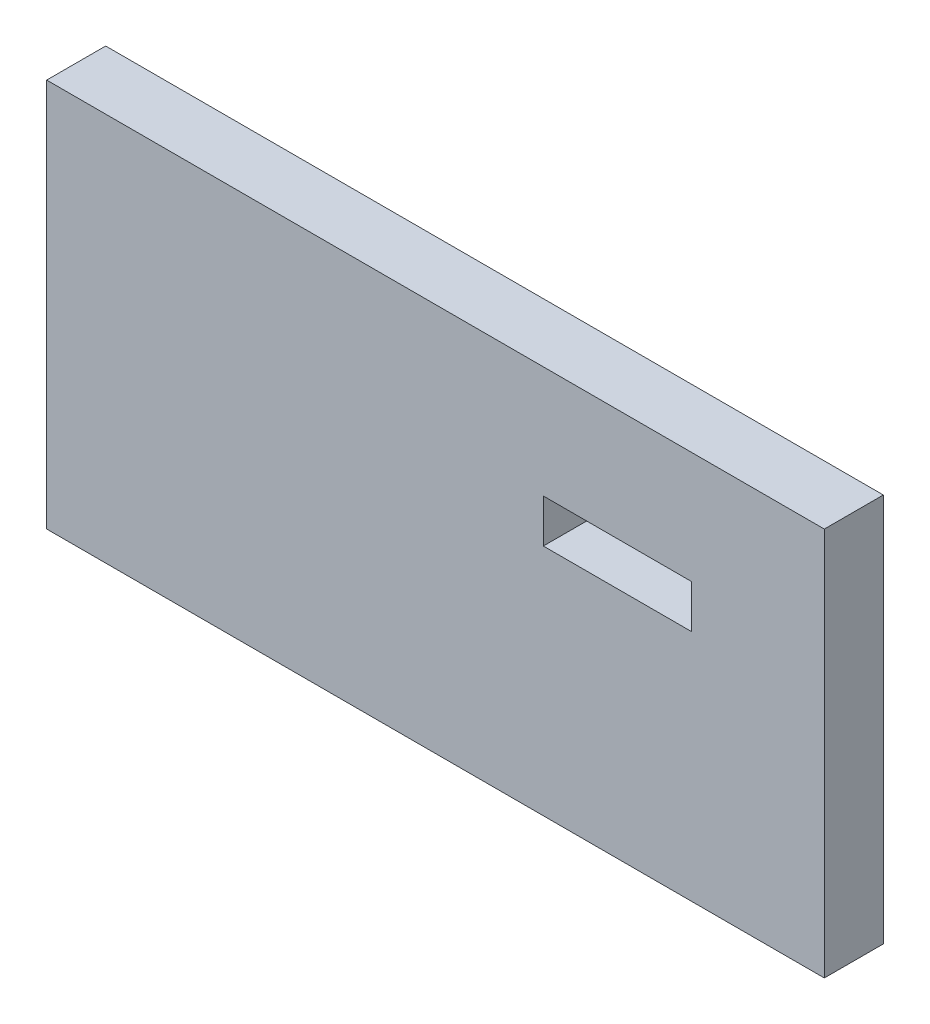
ISO-10303-21;
HEADER;
FILE_DESCRIPTION(('STEP AP214'),'2;1');
FILE_NAME('part.step','',(''),(''),'','','');
FILE_SCHEMA(('AUTOMOTIVE_DESIGN { 1 0 10303 214 1 1 1 1 }'));
ENDSEC;
DATA;
#1=APPLICATION_CONTEXT('core data for automotive mechanical design processes');
#2=APPLICATION_PROTOCOL_DEFINITION('international standard','automotive_design',2000,#1);
#3=PRODUCT_CONTEXT('',#1,'mechanical');
#4=PRODUCT('Part','Part','',(#3));
#5=PRODUCT_RELATED_PRODUCT_CATEGORY('part','',(#4));
#6=PRODUCT_DEFINITION_FORMATION('','',#4);
#7=PRODUCT_DEFINITION_CONTEXT('part definition',#1,'design');
#8=PRODUCT_DEFINITION('design','',#6,#7);
#9=PRODUCT_DEFINITION_SHAPE('','',#8);
#10=(LENGTH_UNIT() NAMED_UNIT(*) SI_UNIT(.MILLI.,.METRE.));
#11=(NAMED_UNIT(*) PLANE_ANGLE_UNIT() SI_UNIT($,.RADIAN.));
#12=(NAMED_UNIT(*) SI_UNIT($,.STERADIAN.) SOLID_ANGLE_UNIT());
#13=UNCERTAINTY_MEASURE_WITH_UNIT(LENGTH_MEASURE(1.E-05),#10,'distance_accuracy_value','');
#14=(GEOMETRIC_REPRESENTATION_CONTEXT(3) GLOBAL_UNCERTAINTY_ASSIGNED_CONTEXT((#13)) GLOBAL_UNIT_ASSIGNED_CONTEXT((#10,
#11,#12)) REPRESENTATION_CONTEXT('',''));
#15=CARTESIAN_POINT('',(0.,0.,0.));
#16=DIRECTION('',(0.,0.,1.));
#17=DIRECTION('',(1.,0.,0.));
#18=AXIS2_PLACEMENT_3D('',#15,#16,#17);
#19=CARTESIAN_POINT('',(0.,0.,10.));
#20=DIRECTION('',(0.,0.,-1.));
#21=DIRECTION('',(-1.,0.,0.));
#22=AXIS2_PLACEMENT_3D('',#19,#20,#21);
#23=PLANE('',#22);
#24=DIRECTION('',(0.,-1.,0.));
#25=VECTOR('',#24,1.);
#26=CARTESIAN_POINT('',(0.,0.,10.));
#27=LINE('',#26,#25);
#28=CARTESIAN_POINT('',(0.,65.8911640348455,10.));
#29=VERTEX_POINT('',#28);
#30=CARTESIAN_POINT('',(0.,0.,10.));
#31=VERTEX_POINT('',#30);
#32=EDGE_CURVE('E136',#29,#31,#27,.T.);
#33=ORIENTED_EDGE('',*,*,#32,.T.);
#34=DIRECTION('',(1.,0.,0.));
#35=VECTOR('',#34,1.);
#36=CARTESIAN_POINT('',(0.,0.,10.));
#37=LINE('',#36,#35);
#38=CARTESIAN_POINT('',(131.782328069691,0.,10.));
#39=VERTEX_POINT('',#38);
#40=EDGE_CURVE('E139',#31,#39,#37,.T.);
#41=ORIENTED_EDGE('',*,*,#40,.T.);
#42=DIRECTION('',(0.,1.,0.));
#43=VECTOR('',#42,1.);
#44=CARTESIAN_POINT('',(131.782328069691,0.,10.));
#45=LINE('',#44,#43);
#46=CARTESIAN_POINT('',(131.782328069691,65.8911640348455,10.));
#47=VERTEX_POINT('',#46);
#48=EDGE_CURVE('E142',#39,#47,#45,.T.);
#49=ORIENTED_EDGE('',*,*,#48,.T.);
#50=DIRECTION('',(-1.,0.,0.));
#51=VECTOR('',#50,1.);
#52=CARTESIAN_POINT('',(0.,65.8911640348455,10.));
#53=LINE('',#52,#51);
#54=EDGE_CURVE('E144',#47,#29,#53,.T.);
#55=ORIENTED_EDGE('',*,*,#54,.T.);
#56=EDGE_LOOP('',(#33,#41,#49,#55));
#57=FACE_BOUND('',#56,.T.);
#58=DIRECTION('',(0.,-1.,0.));
#59=VECTOR('',#58,1.);
#60=CARTESIAN_POINT('',(84.16655227025,46.9355504308775,10.));
#61=LINE('',#60,#59);
#62=CARTESIAN_POINT('',(84.16655227025,46.9355504308775,10.));
#63=VERTEX_POINT('',#62);
#64=CARTESIAN_POINT('',(84.16655227025,39.5891164503924,10.));
#65=VERTEX_POINT('',#64);
#66=EDGE_CURVE('E100',#63,#65,#61,.T.);
#67=ORIENTED_EDGE('',*,*,#66,.F.);
#68=DIRECTION('',(-1.,0.,0.));
#69=VECTOR('',#68,1.);
#70=CARTESIAN_POINT('',(84.16655227025,46.9355504308775,10.));
#71=LINE('',#70,#69);
#72=CARTESIAN_POINT('',(109.289542549193,46.9355504308775,10.));
#73=VERTEX_POINT('',#72);
#74=EDGE_CURVE('E122',#73,#63,#71,.T.);
#75=ORIENTED_EDGE('',*,*,#74,.F.);
#76=DIRECTION('',(0.,1.,0.));
#77=VECTOR('',#76,1.);
#78=CARTESIAN_POINT('',(109.289542549193,46.9355504308775,10.));
#79=LINE('',#78,#77);
#80=CARTESIAN_POINT('',(109.289542549193,39.5891164503924,10.));
#81=VERTEX_POINT('',#80);
#82=EDGE_CURVE('E120',#81,#73,#79,.T.);
#83=ORIENTED_EDGE('',*,*,#82,.F.);
#84=DIRECTION('',(1.,0.,0.));
#85=VECTOR('',#84,1.);
#86=CARTESIAN_POINT('',(84.16655227025,39.5891164503924,10.));
#87=LINE('',#86,#85);
#88=EDGE_CURVE('E108',#65,#81,#87,.T.);
#89=ORIENTED_EDGE('',*,*,#88,.F.);
#90=EDGE_LOOP('',(#67,#75,#83,#89));
#91=FACE_BOUND('',#90,.T.);
#92=ADVANCED_FACE('F35',(#57,#91),#23,.F.);
#93=CARTESIAN_POINT('',(0.,0.,0.));
#94=DIRECTION('',(0.,0.,-1.));
#95=DIRECTION('',(-1.,0.,0.));
#96=AXIS2_PLACEMENT_3D('',#93,#94,#95);
#97=PLANE('',#96);
#98=DIRECTION('',(0.,-1.,0.));
#99=VECTOR('',#98,1.);
#100=CARTESIAN_POINT('',(0.,0.,0.));
#101=LINE('',#100,#99);
#102=CARTESIAN_POINT('',(0.,65.8911640348455,0.));
#103=VERTEX_POINT('',#102);
#104=CARTESIAN_POINT('',(0.,0.,0.));
#105=VERTEX_POINT('',#104);
#106=EDGE_CURVE('E116',#103,#105,#101,.T.);
#107=ORIENTED_EDGE('',*,*,#106,.F.);
#108=DIRECTION('',(-1.,0.,0.));
#109=VECTOR('',#108,1.);
#110=CARTESIAN_POINT('',(0.,65.8911640348455,0.));
#111=LINE('',#110,#109);
#112=CARTESIAN_POINT('',(131.782328069691,65.8911640348455,0.));
#113=VERTEX_POINT('',#112);
#114=EDGE_CURVE('E140',#113,#103,#111,.T.);
#115=ORIENTED_EDGE('',*,*,#114,.F.);
#116=DIRECTION('',(0.,1.,0.));
#117=VECTOR('',#116,1.);
#118=CARTESIAN_POINT('',(131.782328069691,0.,0.));
#119=LINE('',#118,#117);
#120=CARTESIAN_POINT('',(131.782328069691,0.,0.));
#121=VERTEX_POINT('',#120);
#122=EDGE_CURVE('E151',#121,#113,#119,.T.);
#123=ORIENTED_EDGE('',*,*,#122,.F.);
#124=DIRECTION('',(1.,0.,0.));
#125=VECTOR('',#124,1.);
#126=CARTESIAN_POINT('',(0.,0.,0.));
#127=LINE('',#126,#125);
#128=EDGE_CURVE('E149',#105,#121,#127,.T.);
#129=ORIENTED_EDGE('',*,*,#128,.F.);
#130=EDGE_LOOP('',(#107,#115,#123,#129));
#131=FACE_BOUND('',#130,.T.);
#132=DIRECTION('',(-1.,0.,0.));
#133=VECTOR('',#132,1.);
#134=CARTESIAN_POINT('',(84.16655227025,46.9355504308775,0.));
#135=LINE('',#134,#133);
#136=CARTESIAN_POINT('',(109.289542549193,46.9355504308775,0.));
#137=VERTEX_POINT('',#136);
#138=CARTESIAN_POINT('',(84.16655227025,46.9355504308775,0.));
#139=VERTEX_POINT('',#138);
#140=EDGE_CURVE('E109',#137,#139,#135,.T.);
#141=ORIENTED_EDGE('',*,*,#140,.T.);
#142=DIRECTION('',(0.,-1.,0.));
#143=VECTOR('',#142,1.);
#144=CARTESIAN_POINT('',(84.16655227025,46.9355504308775,0.));
#145=LINE('',#144,#143);
#146=CARTESIAN_POINT('',(84.16655227025,39.5891164503924,0.));
#147=VERTEX_POINT('',#146);
#148=EDGE_CURVE('E58',#139,#147,#145,.T.);
#149=ORIENTED_EDGE('',*,*,#148,.T.);
#150=DIRECTION('',(1.,0.,0.));
#151=VECTOR('',#150,1.);
#152=CARTESIAN_POINT('',(84.16655227025,39.5891164503924,0.));
#153=LINE('',#152,#151);
#154=CARTESIAN_POINT('',(109.289542549193,39.5891164503924,0.));
#155=VERTEX_POINT('',#154);
#156=EDGE_CURVE('E115',#147,#155,#153,.T.);
#157=ORIENTED_EDGE('',*,*,#156,.T.);
#158=DIRECTION('',(0.,1.,0.));
#159=VECTOR('',#158,1.);
#160=CARTESIAN_POINT('',(109.289542549193,46.9355504308775,0.));
#161=LINE('',#160,#159);
#162=EDGE_CURVE('E128',#155,#137,#161,.T.);
#163=ORIENTED_EDGE('',*,*,#162,.T.);
#164=EDGE_LOOP('',(#141,#149,#157,#163));
#165=FACE_BOUND('',#164,.T.);
#166=ADVANCED_FACE('F169',(#131,#165),#97,.T.);
#167=CARTESIAN_POINT('',(0.,0.,10.));
#168=DIRECTION('',(1.,0.,0.));
#169=DIRECTION('',(0.,0.,-1.));
#170=AXIS2_PLACEMENT_3D('',#167,#168,#169);
#171=PLANE('',#170);
#172=ORIENTED_EDGE('',*,*,#106,.T.);
#173=DIRECTION('',(0.,0.,-1.));
#174=VECTOR('',#173,1.);
#175=CARTESIAN_POINT('',(0.,0.,10.));
#176=LINE('',#175,#174);
#177=EDGE_CURVE('E11',#31,#105,#176,.T.);
#178=ORIENTED_EDGE('',*,*,#177,.F.);
#179=ORIENTED_EDGE('',*,*,#32,.F.);
#180=DIRECTION('',(0.,0.,-1.));
#181=VECTOR('',#180,1.);
#182=CARTESIAN_POINT('',(0.,65.8911640348455,10.));
#183=LINE('',#182,#181);
#184=EDGE_CURVE('E146',#29,#103,#183,.T.);
#185=ORIENTED_EDGE('',*,*,#184,.T.);
#186=EDGE_LOOP('',(#172,#178,#179,#185));
#187=FACE_BOUND('',#186,.T.);
#188=ADVANCED_FACE('F37',(#187),#171,.F.);
#189=CARTESIAN_POINT('',(0.,0.,10.));
#190=DIRECTION('',(0.,1.,0.));
#191=DIRECTION('',(0.,0.,1.));
#192=AXIS2_PLACEMENT_3D('',#189,#190,#191);
#193=PLANE('',#192);
#194=ORIENTED_EDGE('',*,*,#128,.T.);
#195=DIRECTION('',(0.,0.,-1.));
#196=VECTOR('',#195,1.);
#197=CARTESIAN_POINT('',(131.782328069691,0.,10.));
#198=LINE('',#197,#196);
#199=EDGE_CURVE('E43',#39,#121,#198,.T.);
#200=ORIENTED_EDGE('',*,*,#199,.F.);
#201=ORIENTED_EDGE('',*,*,#40,.F.);
#202=ORIENTED_EDGE('',*,*,#177,.T.);
#203=EDGE_LOOP('',(#194,#200,#201,#202));
#204=FACE_BOUND('',#203,.T.);
#205=ADVANCED_FACE('F179',(#204),#193,.F.);
#206=CARTESIAN_POINT('',(131.782328069691,0.,10.));
#207=DIRECTION('',(-1.,0.,0.));
#208=DIRECTION('',(0.,0.,1.));
#209=AXIS2_PLACEMENT_3D('',#206,#207,#208);
#210=PLANE('',#209);
#211=ORIENTED_EDGE('',*,*,#122,.T.);
#212=DIRECTION('',(0.,0.,-1.));
#213=VECTOR('',#212,1.);
#214=CARTESIAN_POINT('',(131.782328069691,65.8911640348455,10.));
#215=LINE('',#214,#213);
#216=EDGE_CURVE('E156',#47,#113,#215,.T.);
#217=ORIENTED_EDGE('',*,*,#216,.F.);
#218=ORIENTED_EDGE('',*,*,#48,.F.);
#219=ORIENTED_EDGE('',*,*,#199,.T.);
#220=EDGE_LOOP('',(#211,#217,#218,#219));
#221=FACE_BOUND('',#220,.T.);
#222=ADVANCED_FACE('F163',(#221),#210,.F.);
#223=CARTESIAN_POINT('',(0.,65.8911640348455,10.));
#224=DIRECTION('',(0.,-1.,0.));
#225=DIRECTION('',(0.,0.,-1.));
#226=AXIS2_PLACEMENT_3D('',#223,#224,#225);
#227=PLANE('',#226);
#228=ORIENTED_EDGE('',*,*,#114,.T.);
#229=ORIENTED_EDGE('',*,*,#184,.F.);
#230=ORIENTED_EDGE('',*,*,#54,.F.);
#231=ORIENTED_EDGE('',*,*,#216,.T.);
#232=EDGE_LOOP('',(#228,#229,#230,#231));
#233=FACE_BOUND('',#232,.T.);
#234=ADVANCED_FACE('F173',(#233),#227,.F.);
#235=CARTESIAN_POINT('',(84.16655227025,46.9355504308775,10.));
#236=DIRECTION('',(1.,0.,0.));
#237=DIRECTION('',(0.,0.,-1.));
#238=AXIS2_PLACEMENT_3D('',#235,#236,#237);
#239=PLANE('',#238);
#240=ORIENTED_EDGE('',*,*,#148,.F.);
#241=DIRECTION('',(0.,0.,-1.));
#242=VECTOR('',#241,1.);
#243=CARTESIAN_POINT('',(84.16655227025,46.9355504308775,10.));
#244=LINE('',#243,#242);
#245=EDGE_CURVE('E104',#63,#139,#244,.T.);
#246=ORIENTED_EDGE('',*,*,#245,.F.);
#247=ORIENTED_EDGE('',*,*,#66,.T.);
#248=DIRECTION('',(0.,0.,-1.));
#249=VECTOR('',#248,1.);
#250=CARTESIAN_POINT('',(84.16655227025,39.5891164503924,10.));
#251=LINE('',#250,#249);
#252=EDGE_CURVE('E103',#65,#147,#251,.T.);
#253=ORIENTED_EDGE('',*,*,#252,.T.);
#254=EDGE_LOOP('',(#240,#246,#247,#253));
#255=FACE_BOUND('',#254,.T.);
#256=ADVANCED_FACE('F102',(#255),#239,.T.);
#257=CARTESIAN_POINT('',(84.16655227025,39.5891164503924,10.));
#258=DIRECTION('',(0.,1.,0.));
#259=DIRECTION('',(0.,0.,1.));
#260=AXIS2_PLACEMENT_3D('',#257,#258,#259);
#261=PLANE('',#260);
#262=ORIENTED_EDGE('',*,*,#156,.F.);
#263=ORIENTED_EDGE('',*,*,#252,.F.);
#264=ORIENTED_EDGE('',*,*,#88,.T.);
#265=DIRECTION('',(0.,0.,-1.));
#266=VECTOR('',#265,1.);
#267=CARTESIAN_POINT('',(109.289542549193,39.5891164503924,10.));
#268=LINE('',#267,#266);
#269=EDGE_CURVE('E117',#81,#155,#268,.T.);
#270=ORIENTED_EDGE('',*,*,#269,.T.);
#271=EDGE_LOOP('',(#262,#263,#264,#270));
#272=FACE_BOUND('',#271,.T.);
#273=ADVANCED_FACE('F112',(#272),#261,.T.);
#274=CARTESIAN_POINT('',(109.289542549193,46.9355504308775,10.));
#275=DIRECTION('',(-1.,0.,0.));
#276=DIRECTION('',(0.,0.,1.));
#277=AXIS2_PLACEMENT_3D('',#274,#275,#276);
#278=PLANE('',#277);
#279=ORIENTED_EDGE('',*,*,#162,.F.);
#280=ORIENTED_EDGE('',*,*,#269,.F.);
#281=ORIENTED_EDGE('',*,*,#82,.T.);
#282=DIRECTION('',(0.,0.,-1.));
#283=VECTOR('',#282,1.);
#284=CARTESIAN_POINT('',(109.289542549193,46.9355504308775,10.));
#285=LINE('',#284,#283);
#286=EDGE_CURVE('E50',#73,#137,#285,.T.);
#287=ORIENTED_EDGE('',*,*,#286,.T.);
#288=EDGE_LOOP('',(#279,#280,#281,#287));
#289=FACE_BOUND('',#288,.T.);
#290=ADVANCED_FACE('F202',(#289),#278,.T.);
#291=CARTESIAN_POINT('',(84.16655227025,46.9355504308775,10.));
#292=DIRECTION('',(0.,-1.,0.));
#293=DIRECTION('',(0.,0.,-1.));
#294=AXIS2_PLACEMENT_3D('',#291,#292,#293);
#295=PLANE('',#294);
#296=ORIENTED_EDGE('',*,*,#140,.F.);
#297=ORIENTED_EDGE('',*,*,#286,.F.);
#298=ORIENTED_EDGE('',*,*,#74,.T.);
#299=ORIENTED_EDGE('',*,*,#245,.T.);
#300=EDGE_LOOP('',(#296,#297,#298,#299));
#301=FACE_BOUND('',#300,.T.);
#302=ADVANCED_FACE('F206',(#301),#295,.T.);
#303=CLOSED_SHELL('',(#92,#166,#188,#205,#222,#234,#256,#273,#290,#302));
#304=MANIFOLD_SOLID_BREP('B2',#303);
#305=ADVANCED_BREP_SHAPE_REPRESENTATION('',(#18,#304),#14);
#306=SHAPE_DEFINITION_REPRESENTATION(#9,#305);
ENDSEC;
END-ISO-10303-21;
